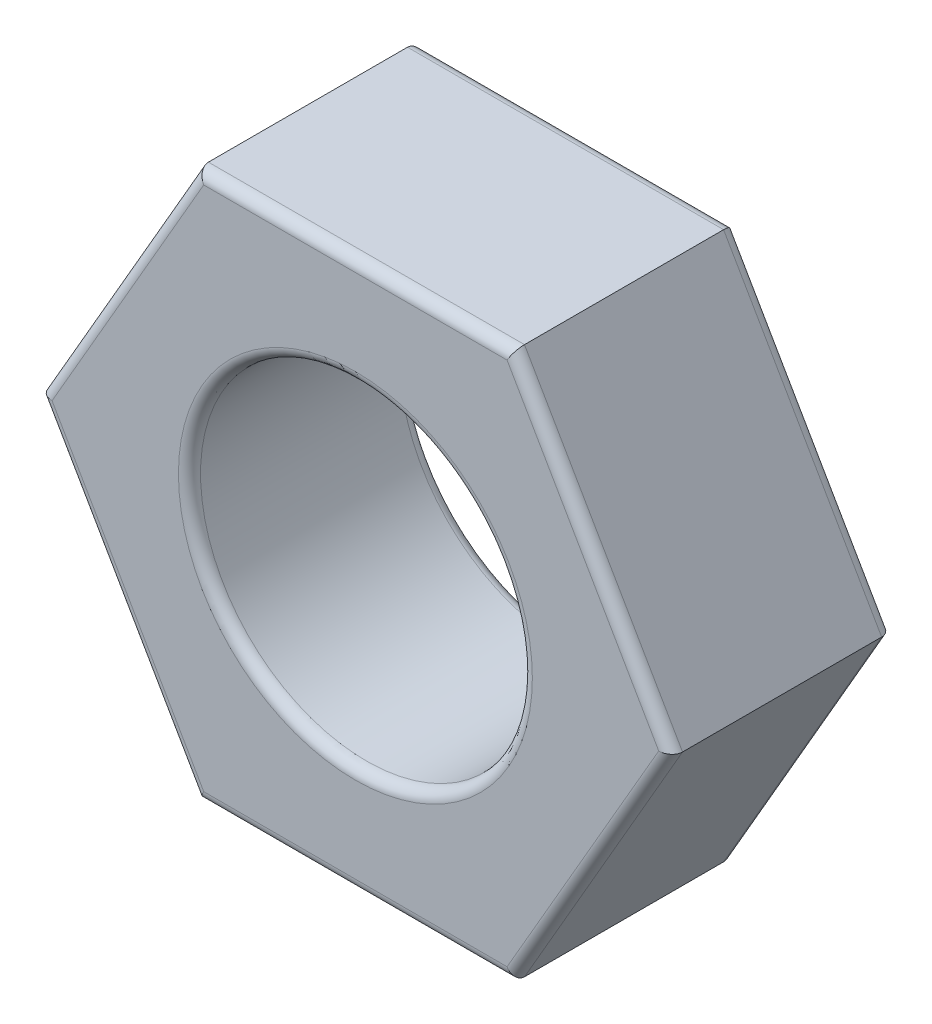
ISO-10303-21;
HEADER;
FILE_DESCRIPTION(('STEP AP214'),'2;1');
FILE_NAME('part.step','',(''),(''),'','','');
FILE_SCHEMA(('AUTOMOTIVE_DESIGN { 1 0 10303 214 1 1 1 1 }'));
ENDSEC;
DATA;
#1=APPLICATION_CONTEXT('core data for automotive mechanical design processes');
#2=APPLICATION_PROTOCOL_DEFINITION('international standard','automotive_design',2000,#1);
#3=PRODUCT_CONTEXT('',#1,'mechanical');
#4=PRODUCT('Part','Part','',(#3));
#5=PRODUCT_RELATED_PRODUCT_CATEGORY('part','',(#4));
#6=PRODUCT_DEFINITION_FORMATION('','',#4);
#7=PRODUCT_DEFINITION_CONTEXT('part definition',#1,'design');
#8=PRODUCT_DEFINITION('design','',#6,#7);
#9=PRODUCT_DEFINITION_SHAPE('','',#8);
#10=(LENGTH_UNIT() NAMED_UNIT(*) SI_UNIT(.MILLI.,.METRE.));
#11=(NAMED_UNIT(*) PLANE_ANGLE_UNIT() SI_UNIT($,.RADIAN.));
#12=(NAMED_UNIT(*) SI_UNIT($,.STERADIAN.) SOLID_ANGLE_UNIT());
#13=UNCERTAINTY_MEASURE_WITH_UNIT(LENGTH_MEASURE(1.E-05),#10,'distance_accuracy_value','');
#14=(GEOMETRIC_REPRESENTATION_CONTEXT(3) GLOBAL_UNCERTAINTY_ASSIGNED_CONTEXT((#13)) GLOBAL_UNIT_ASSIGNED_CONTEXT((#10,
#11,#12)) REPRESENTATION_CONTEXT('',''));
#15=CARTESIAN_POINT('',(0.,0.,0.));
#16=DIRECTION('',(0.,0.,1.));
#17=DIRECTION('',(1.,0.,0.));
#18=AXIS2_PLACEMENT_3D('',#15,#16,#17);
#19=CARTESIAN_POINT('',(0.,9.90000000000001,4.));
#20=DIRECTION('',(0.,0.,1.));
#21=DIRECTION('',(1.,0.,0.));
#22=AXIS2_PLACEMENT_3D('',#19,#20,#21);
#23=PLANE('',#22);
#24=CARTESIAN_POINT('',(0.,0.,4.));
#25=DIRECTION('',(0.,0.,1.));
#26=DIRECTION('',(1.,0.,0.));
#27=AXIS2_PLACEMENT_3D('',#24,#25,#26);
#28=CIRCLE('',#27,3.2);
#29=CARTESIAN_POINT('',(3.2,0.,4.));
#30=VERTEX_POINT('',#29);
#31=EDGE_CURVE('E11',#30,#30,#28,.F.);
#32=ORIENTED_EDGE('',*,*,#31,.T.);
#33=EDGE_LOOP('',(#32));
#34=FACE_BOUND('',#33,.T.);
#35=DIRECTION('',(1.,0.,0.));
#36=VECTOR('',#35,1.);
#37=CARTESIAN_POINT('',(2.85788383248865,-4.75,4.));
#38=LINE('',#37,#36);
#39=CARTESIAN_POINT('',(-2.74241377865073,-4.75,4.));
#40=VERTEX_POINT('',#39);
#41=CARTESIAN_POINT('',(2.74241377865073,-4.75,4.));
#42=VERTEX_POINT('',#41);
#43=EDGE_CURVE('E42',#40,#42,#38,.T.);
#44=ORIENTED_EDGE('',*,*,#43,.T.);
#45=DIRECTION('',(0.5,0.866025403784439,0.));
#46=VECTOR('',#45,1.);
#47=CARTESIAN_POINT('',(5.54256258422041,0.0999999999999977,4.));
#48=LINE('',#47,#46);
#49=CARTESIAN_POINT('',(5.48482755730145,0.,4.));
#50=VERTEX_POINT('',#49);
#51=EDGE_CURVE('E35',#42,#50,#48,.T.);
#52=ORIENTED_EDGE('',*,*,#51,.T.);
#53=DIRECTION('',(-0.5,0.866025403784439,0.));
#54=VECTOR('',#53,1.);
#55=CARTESIAN_POINT('',(2.68467875173176,4.85,4.));
#56=LINE('',#55,#54);
#57=CARTESIAN_POINT('',(2.74241377865072,4.75000000000001,4.));
#58=VERTEX_POINT('',#57);
#59=EDGE_CURVE('E181',#50,#58,#56,.T.);
#60=ORIENTED_EDGE('',*,*,#59,.T.);
#61=DIRECTION('',(-1.,0.,0.));
#62=VECTOR('',#61,1.);
#63=CARTESIAN_POINT('',(-2.85788383248865,4.75000000000001,4.));
#64=LINE('',#63,#62);
#65=CARTESIAN_POINT('',(-2.74241377865072,4.75000000000001,4.));
#66=VERTEX_POINT('',#65);
#67=EDGE_CURVE('E183',#58,#66,#64,.T.);
#68=ORIENTED_EDGE('',*,*,#67,.T.);
#69=DIRECTION('',(-0.5,-0.866025403784439,0.));
#70=VECTOR('',#69,1.);
#71=CARTESIAN_POINT('',(-5.54256258422041,-0.100000000000003,4.));
#72=LINE('',#71,#70);
#73=CARTESIAN_POINT('',(-5.48482755730145,0.,4.));
#74=VERTEX_POINT('',#73);
#75=EDGE_CURVE('E185',#66,#74,#72,.T.);
#76=ORIENTED_EDGE('',*,*,#75,.T.);
#77=DIRECTION('',(0.5,-0.866025403784439,0.));
#78=VECTOR('',#77,1.);
#79=CARTESIAN_POINT('',(-2.68467875173176,-4.85,4.));
#80=LINE('',#79,#78);
#81=EDGE_CURVE('E47',#74,#40,#80,.T.);
#82=ORIENTED_EDGE('',*,*,#81,.T.);
#83=EDGE_LOOP('',(#44,#52,#60,#68,#76,#82));
#84=FACE_BOUND('',#83,.T.);
#85=ADVANCED_FACE('F27',(#34,#84),#23,.T.);
#86=CARTESIAN_POINT('',(0.,9.90000000000001,0.));
#87=DIRECTION('',(0.,0.,1.));
#88=DIRECTION('',(1.,0.,0.));
#89=AXIS2_PLACEMENT_3D('',#86,#87,#88);
#90=PLANE('',#89);
#91=CARTESIAN_POINT('',(0.,0.,0.));
#92=DIRECTION('',(0.,0.,1.));
#93=DIRECTION('',(1.,0.,0.));
#94=AXIS2_PLACEMENT_3D('',#91,#92,#93);
#95=CIRCLE('',#94,3.2);
#96=CARTESIAN_POINT('',(3.2,0.,0.));
#97=VERTEX_POINT('',#96);
#98=EDGE_CURVE('E143',#97,#97,#95,.T.);
#99=ORIENTED_EDGE('',*,*,#98,.T.);
#100=EDGE_LOOP('',(#99));
#101=FACE_BOUND('',#100,.T.);
#102=DIRECTION('',(-0.5,-0.866025403784439,0.));
#103=VECTOR('',#102,1.);
#104=CARTESIAN_POINT('',(0.173205080756888,9.8,0.));
#105=LINE('',#104,#103);
#106=CARTESIAN_POINT('',(-5.48482755730145,0.,0.));
#107=VERTEX_POINT('',#106);
#108=CARTESIAN_POINT('',(-2.74241377865072,4.75000000000001,0.));
#109=VERTEX_POINT('',#108);
#110=EDGE_CURVE('E142',#107,#109,#105,.F.);
#111=ORIENTED_EDGE('',*,*,#110,.T.);
#112=DIRECTION('',(-1.,0.,0.));
#113=VECTOR('',#112,1.);
#114=CARTESIAN_POINT('',(0.,4.75000000000001,0.));
#115=LINE('',#114,#113);
#116=CARTESIAN_POINT('',(2.74241377865072,4.75000000000001,0.));
#117=VERTEX_POINT('',#116);
#118=EDGE_CURVE('E121',#109,#117,#115,.F.);
#119=ORIENTED_EDGE('',*,*,#118,.T.);
#120=DIRECTION('',(-0.5,0.866025403784439,0.));
#121=VECTOR('',#120,1.);
#122=CARTESIAN_POINT('',(-0.173205080756887,9.80000000000001,0.));
#123=LINE('',#122,#121);
#124=CARTESIAN_POINT('',(5.48482755730145,0.,0.));
#125=VERTEX_POINT('',#124);
#126=EDGE_CURVE('E131',#117,#125,#123,.F.);
#127=ORIENTED_EDGE('',*,*,#126,.T.);
#128=DIRECTION('',(0.5,0.866025403784439,0.));
#129=VECTOR('',#128,1.);
#130=CARTESIAN_POINT('',(8.40044641670906,5.05,0.));
#131=LINE('',#130,#129);
#132=CARTESIAN_POINT('',(2.74241377865073,-4.75,0.));
#133=VERTEX_POINT('',#132);
#134=EDGE_CURVE('E137',#125,#133,#131,.F.);
#135=ORIENTED_EDGE('',*,*,#134,.T.);
#136=DIRECTION('',(1.,0.,0.));
#137=VECTOR('',#136,1.);
#138=CARTESIAN_POINT('',(0.,-4.75,0.));
#139=LINE('',#138,#137);
#140=CARTESIAN_POINT('',(-2.74241377865073,-4.75,0.));
#141=VERTEX_POINT('',#140);
#142=EDGE_CURVE('E247',#133,#141,#139,.F.);
#143=ORIENTED_EDGE('',*,*,#142,.T.);
#144=DIRECTION('',(0.5,-0.866025403784439,0.));
#145=VECTOR('',#144,1.);
#146=CARTESIAN_POINT('',(-8.40044641670906,5.05,0.));
#147=LINE('',#146,#145);
#148=EDGE_CURVE('E148',#141,#107,#147,.F.);
#149=ORIENTED_EDGE('',*,*,#148,.T.);
#150=EDGE_LOOP('',(#111,#119,#127,#135,#143,#149));
#151=FACE_BOUND('',#150,.T.);
#152=ADVANCED_FACE('F140',(#101,#151),#90,.F.);
#153=CARTESIAN_POINT('',(5.7157676649773,0.,4.));
#154=DIRECTION('',(-0.866025403784439,-0.5,0.));
#155=DIRECTION('',(0.5,-0.866025403784439,0.));
#156=AXIS2_PLACEMENT_3D('',#153,#154,#155);
#157=PLANE('',#156);
#158=DIRECTION('',(0.,0.,-1.));
#159=VECTOR('',#158,1.);
#160=CARTESIAN_POINT('',(5.7157676649773,0.,4.));
#161=LINE('',#160,#159);
#162=CARTESIAN_POINT('',(5.7157676649773,0.,3.8));
#163=VERTEX_POINT('',#162);
#164=CARTESIAN_POINT('',(5.7157676649773,0.,0.2));
#165=VERTEX_POINT('',#164);
#166=EDGE_CURVE('E229',#163,#165,#161,.T.);
#167=ORIENTED_EDGE('',*,*,#166,.T.);
#168=DIRECTION('',(-0.5,0.866025403784439,0.));
#169=VECTOR('',#168,1.);
#170=CARTESIAN_POINT('',(5.7157676649773,0.,0.2));
#171=LINE('',#170,#169);
#172=CARTESIAN_POINT('',(2.85788383248865,4.95000000000001,0.2));
#173=VERTEX_POINT('',#172);
#174=EDGE_CURVE('E179',#165,#173,#171,.T.);
#175=ORIENTED_EDGE('',*,*,#174,.T.);
#176=DIRECTION('',(0.,0.,-1.));
#177=VECTOR('',#176,1.);
#178=CARTESIAN_POINT('',(2.85788383248865,4.95000000000001,4.));
#179=LINE('',#178,#177);
#180=CARTESIAN_POINT('',(2.85788383248865,4.95000000000001,3.8));
#181=VERTEX_POINT('',#180);
#182=EDGE_CURVE('E138',#181,#173,#179,.T.);
#183=ORIENTED_EDGE('',*,*,#182,.F.);
#184=DIRECTION('',(-0.5,0.866025403784439,0.));
#185=VECTOR('',#184,1.);
#186=CARTESIAN_POINT('',(5.7157676649773,0.,3.8));
#187=LINE('',#186,#185);
#188=EDGE_CURVE('E177',#181,#163,#187,.F.);
#189=ORIENTED_EDGE('',*,*,#188,.T.);
#190=EDGE_LOOP('',(#167,#175,#183,#189));
#191=FACE_BOUND('',#190,.T.);
#192=ADVANCED_FACE('F29',(#191),#157,.F.);
#193=CARTESIAN_POINT('',(2.85788383248865,4.95000000000001,4.));
#194=DIRECTION('',(0.,-1.,0.));
#195=DIRECTION('',(0.,0.,-1.));
#196=AXIS2_PLACEMENT_3D('',#193,#194,#195);
#197=PLANE('',#196);
#198=ORIENTED_EDGE('',*,*,#182,.T.);
#199=DIRECTION('',(-1.,0.,0.));
#200=VECTOR('',#199,1.);
#201=CARTESIAN_POINT('',(2.85788383248865,4.95000000000001,0.2));
#202=LINE('',#201,#200);
#203=CARTESIAN_POINT('',(-2.85788383248865,4.95000000000001,0.2));
#204=VERTEX_POINT('',#203);
#205=EDGE_CURVE('E124',#173,#204,#202,.T.);
#206=ORIENTED_EDGE('',*,*,#205,.T.);
#207=DIRECTION('',(0.,0.,-1.));
#208=VECTOR('',#207,1.);
#209=CARTESIAN_POINT('',(-2.85788383248865,4.95000000000001,4.));
#210=LINE('',#209,#208);
#211=CARTESIAN_POINT('',(-2.85788383248865,4.95000000000001,3.8));
#212=VERTEX_POINT('',#211);
#213=EDGE_CURVE('E241',#212,#204,#210,.T.);
#214=ORIENTED_EDGE('',*,*,#213,.F.);
#215=DIRECTION('',(-1.,0.,0.));
#216=VECTOR('',#215,1.);
#217=CARTESIAN_POINT('',(2.85788383248865,4.95000000000001,3.8));
#218=LINE('',#217,#216);
#219=EDGE_CURVE('E157',#212,#181,#218,.F.);
#220=ORIENTED_EDGE('',*,*,#219,.T.);
#221=EDGE_LOOP('',(#198,#206,#214,#220));
#222=FACE_BOUND('',#221,.T.);
#223=ADVANCED_FACE('F262',(#222),#197,.F.);
#224=CARTESIAN_POINT('',(-2.85788383248865,4.95000000000001,4.));
#225=DIRECTION('',(0.866025403784438,-0.5,0.));
#226=DIRECTION('',(0.5,0.866025403784439,0.));
#227=AXIS2_PLACEMENT_3D('',#224,#225,#226);
#228=PLANE('',#227);
#229=ORIENTED_EDGE('',*,*,#213,.T.);
#230=DIRECTION('',(-0.5,-0.866025403784439,0.));
#231=VECTOR('',#230,1.);
#232=CARTESIAN_POINT('',(-2.85788383248865,4.95000000000001,0.2));
#233=LINE('',#232,#231);
#234=CARTESIAN_POINT('',(-5.7157676649773,0.,0.2));
#235=VERTEX_POINT('',#234);
#236=EDGE_CURVE('E162',#204,#235,#233,.T.);
#237=ORIENTED_EDGE('',*,*,#236,.T.);
#238=DIRECTION('',(0.,0.,-1.));
#239=VECTOR('',#238,1.);
#240=CARTESIAN_POINT('',(-5.7157676649773,0.,4.));
#241=LINE('',#240,#239);
#242=CARTESIAN_POINT('',(-5.7157676649773,0.,3.8));
#243=VERTEX_POINT('',#242);
#244=EDGE_CURVE('E238',#243,#235,#241,.T.);
#245=ORIENTED_EDGE('',*,*,#244,.F.);
#246=DIRECTION('',(-0.5,-0.866025403784439,0.));
#247=VECTOR('',#246,1.);
#248=CARTESIAN_POINT('',(-2.85788383248865,4.95,3.8));
#249=LINE('',#248,#247);
#250=EDGE_CURVE('E160',#243,#212,#249,.F.);
#251=ORIENTED_EDGE('',*,*,#250,.T.);
#252=EDGE_LOOP('',(#229,#237,#245,#251));
#253=FACE_BOUND('',#252,.T.);
#254=ADVANCED_FACE('F265',(#253),#228,.F.);
#255=CARTESIAN_POINT('',(-5.7157676649773,0.,4.));
#256=DIRECTION('',(0.866025403784439,0.5,0.));
#257=DIRECTION('',(-0.5,0.866025403784439,0.));
#258=AXIS2_PLACEMENT_3D('',#255,#256,#257);
#259=PLANE('',#258);
#260=ORIENTED_EDGE('',*,*,#244,.T.);
#261=DIRECTION('',(0.5,-0.866025403784439,0.));
#262=VECTOR('',#261,1.);
#263=CARTESIAN_POINT('',(-5.7157676649773,0.,0.2));
#264=LINE('',#263,#262);
#265=CARTESIAN_POINT('',(-2.85788383248865,-4.95,0.2));
#266=VERTEX_POINT('',#265);
#267=EDGE_CURVE('E166',#235,#266,#264,.T.);
#268=ORIENTED_EDGE('',*,*,#267,.T.);
#269=DIRECTION('',(0.,0.,-1.));
#270=VECTOR('',#269,1.);
#271=CARTESIAN_POINT('',(-2.85788383248865,-4.95,4.));
#272=LINE('',#271,#270);
#273=CARTESIAN_POINT('',(-2.85788383248865,-4.95,3.8));
#274=VERTEX_POINT('',#273);
#275=EDGE_CURVE('E235',#274,#266,#272,.T.);
#276=ORIENTED_EDGE('',*,*,#275,.F.);
#277=DIRECTION('',(0.5,-0.866025403784439,0.));
#278=VECTOR('',#277,1.);
#279=CARTESIAN_POINT('',(-5.7157676649773,0.,3.8));
#280=LINE('',#279,#278);
#281=EDGE_CURVE('E164',#274,#243,#280,.F.);
#282=ORIENTED_EDGE('',*,*,#281,.T.);
#283=EDGE_LOOP('',(#260,#268,#276,#282));
#284=FACE_BOUND('',#283,.T.);
#285=ADVANCED_FACE('F310',(#284),#259,.F.);
#286=CARTESIAN_POINT('',(-2.85788383248865,-4.95,4.));
#287=DIRECTION('',(0.,1.,0.));
#288=DIRECTION('',(0.,0.,1.));
#289=AXIS2_PLACEMENT_3D('',#286,#287,#288);
#290=PLANE('',#289);
#291=ORIENTED_EDGE('',*,*,#275,.T.);
#292=DIRECTION('',(1.,0.,0.));
#293=VECTOR('',#292,1.);
#294=CARTESIAN_POINT('',(-2.85788383248865,-4.95,0.2));
#295=LINE('',#294,#293);
#296=CARTESIAN_POINT('',(2.85788383248865,-4.95,0.2));
#297=VERTEX_POINT('',#296);
#298=EDGE_CURVE('E170',#266,#297,#295,.T.);
#299=ORIENTED_EDGE('',*,*,#298,.T.);
#300=DIRECTION('',(0.,0.,-1.));
#301=VECTOR('',#300,1.);
#302=CARTESIAN_POINT('',(2.85788383248865,-4.95,4.));
#303=LINE('',#302,#301);
#304=CARTESIAN_POINT('',(2.85788383248865,-4.95,3.8));
#305=VERTEX_POINT('',#304);
#306=EDGE_CURVE('E232',#305,#297,#303,.T.);
#307=ORIENTED_EDGE('',*,*,#306,.F.);
#308=DIRECTION('',(1.,0.,0.));
#309=VECTOR('',#308,1.);
#310=CARTESIAN_POINT('',(-2.85788383248865,-4.95,3.8));
#311=LINE('',#310,#309);
#312=EDGE_CURVE('E168',#305,#274,#311,.F.);
#313=ORIENTED_EDGE('',*,*,#312,.T.);
#314=EDGE_LOOP('',(#291,#299,#307,#313));
#315=FACE_BOUND('',#314,.T.);
#316=ADVANCED_FACE('F283',(#315),#290,.F.);
#317=CARTESIAN_POINT('',(2.85788383248865,-4.95,4.));
#318=DIRECTION('',(-0.866025403784439,0.5,0.));
#319=DIRECTION('',(-0.5,-0.866025403784439,0.));
#320=AXIS2_PLACEMENT_3D('',#317,#318,#319);
#321=PLANE('',#320);
#322=ORIENTED_EDGE('',*,*,#306,.T.);
#323=DIRECTION('',(0.5,0.866025403784439,0.));
#324=VECTOR('',#323,1.);
#325=CARTESIAN_POINT('',(2.85788383248865,-4.95,0.2));
#326=LINE('',#325,#324);
#327=EDGE_CURVE('E175',#297,#165,#326,.T.);
#328=ORIENTED_EDGE('',*,*,#327,.T.);
#329=ORIENTED_EDGE('',*,*,#166,.F.);
#330=DIRECTION('',(0.5,0.866025403784439,0.));
#331=VECTOR('',#330,1.);
#332=CARTESIAN_POINT('',(2.85788383248865,-4.95000000000001,3.8));
#333=LINE('',#332,#331);
#334=EDGE_CURVE('E172',#163,#305,#333,.F.);
#335=ORIENTED_EDGE('',*,*,#334,.T.);
#336=EDGE_LOOP('',(#322,#328,#329,#335));
#337=FACE_BOUND('',#336,.T.);
#338=ADVANCED_FACE('F281',(#337),#321,.F.);
#339=CARTESIAN_POINT('',(0.,0.,4.));
#340=DIRECTION('',(0.,0.,-1.));
#341=DIRECTION('',(-1.,0.,0.));
#342=AXIS2_PLACEMENT_3D('',#339,#340,#341);
#343=CYLINDRICAL_SURFACE('',#342,3.);
#344=CARTESIAN_POINT('',(0.,0.,0.2));
#345=DIRECTION('',(0.,0.,1.));
#346=DIRECTION('',(1.,0.,0.));
#347=AXIS2_PLACEMENT_3D('',#344,#345,#346);
#348=CIRCLE('',#347,3.);
#349=CARTESIAN_POINT('',(3.,0.,0.2));
#350=VERTEX_POINT('',#349);
#351=EDGE_CURVE('E154',#350,#350,#348,.F.);
#352=ORIENTED_EDGE('',*,*,#351,.T.);
#353=EDGE_LOOP('',(#352));
#354=FACE_BOUND('',#353,.T.);
#355=CARTESIAN_POINT('',(0.,0.,3.8));
#356=DIRECTION('',(0.,0.,1.));
#357=DIRECTION('',(1.,0.,0.));
#358=AXIS2_PLACEMENT_3D('',#355,#356,#357);
#359=CIRCLE('',#358,3.);
#360=CARTESIAN_POINT('',(3.,0.,3.8));
#361=VERTEX_POINT('',#360);
#362=EDGE_CURVE('E146',#361,#361,#359,.T.);
#363=ORIENTED_EDGE('',*,*,#362,.T.);
#364=EDGE_LOOP('',(#363));
#365=FACE_BOUND('',#364,.T.);
#366=ADVANCED_FACE('F307',(#354,#365),#343,.F.);
#367=CARTESIAN_POINT('',(0.,0.,0.2));
#368=DIRECTION('',(0.,0.,1.));
#369=DIRECTION('',(1.,0.,0.));
#370=AXIS2_PLACEMENT_3D('',#367,#368,#369);
#371=TOROIDAL_SURFACE('',#370,3.2,0.2);
#372=ORIENTED_EDGE('',*,*,#351,.F.);
#373=EDGE_LOOP('',(#372));
#374=FACE_BOUND('',#373,.T.);
#375=ORIENTED_EDGE('',*,*,#98,.F.);
#376=EDGE_LOOP('',(#375));
#377=FACE_BOUND('',#376,.T.);
#378=ADVANCED_FACE('F337',(#374,#377),#371,.T.);
#379=CARTESIAN_POINT('',(-2.85788383248865,-4.75,0.2));
#380=DIRECTION('',(1.,0.,0.));
#381=DIRECTION('',(0.,0.,-1.));
#382=AXIS2_PLACEMENT_3D('',#379,#380,#381);
#383=CYLINDRICAL_SURFACE('',#382,0.2);
#384=CARTESIAN_POINT('',(-2.74241377865073,-4.75,0.2));
#385=DIRECTION('',(0.866025403784439,-0.5,0.));
#386=DIRECTION('',(0.5,0.866025403784439,0.));
#387=AXIS2_PLACEMENT_3D('',#384,#385,#386);
#388=ELLIPSE('',#387,0.23094010767585,0.2);
#389=EDGE_CURVE('E223',#141,#266,#388,.F.);
#390=ORIENTED_EDGE('',*,*,#389,.F.);
#391=ORIENTED_EDGE('',*,*,#142,.F.);
#392=CARTESIAN_POINT('',(2.74241377865073,-4.75,0.2));
#393=DIRECTION('',(0.866025403784439,0.5,0.));
#394=DIRECTION('',(-0.5,0.866025403784439,0.));
#395=AXIS2_PLACEMENT_3D('',#392,#393,#394);
#396=ELLIPSE('',#395,0.23094010767585,0.2);
#397=EDGE_CURVE('E226',#297,#133,#396,.T.);
#398=ORIENTED_EDGE('',*,*,#397,.F.);
#399=ORIENTED_EDGE('',*,*,#298,.F.);
#400=EDGE_LOOP('',(#390,#391,#398,#399));
#401=FACE_BOUND('',#400,.T.);
#402=ADVANCED_FACE('F286',(#401),#383,.T.);
#403=CARTESIAN_POINT('',(2.68467875173176,-4.85,0.2));
#404=DIRECTION('',(0.5,0.866025403784439,0.));
#405=DIRECTION('',(-0.866025403784439,0.5,0.));
#406=AXIS2_PLACEMENT_3D('',#403,#404,#405);
#407=CYLINDRICAL_SURFACE('',#406,0.2);
#408=ORIENTED_EDGE('',*,*,#397,.T.);
#409=ORIENTED_EDGE('',*,*,#134,.F.);
#410=CARTESIAN_POINT('',(5.48482755730145,0.,0.2));
#411=DIRECTION('',(0.,1.,0.));
#412=DIRECTION('',(-1.,0.,0.));
#413=AXIS2_PLACEMENT_3D('',#410,#411,#412);
#414=ELLIPSE('',#413,0.23094010767585,0.2);
#415=EDGE_CURVE('E134',#165,#125,#414,.T.);
#416=ORIENTED_EDGE('',*,*,#415,.F.);
#417=ORIENTED_EDGE('',*,*,#327,.F.);
#418=EDGE_LOOP('',(#408,#409,#416,#417));
#419=FACE_BOUND('',#418,.T.);
#420=ADVANCED_FACE('F289',(#419),#407,.T.);
#421=CARTESIAN_POINT('',(-5.54256258422041,0.100000000000001,0.2));
#422=DIRECTION('',(0.5,-0.866025403784439,0.));
#423=DIRECTION('',(0.866025403784439,0.5,0.));
#424=AXIS2_PLACEMENT_3D('',#421,#422,#423);
#425=CYLINDRICAL_SURFACE('',#424,0.2);
#426=ORIENTED_EDGE('',*,*,#389,.T.);
#427=ORIENTED_EDGE('',*,*,#267,.F.);
#428=CARTESIAN_POINT('',(-5.48482755730145,0.,0.2));
#429=DIRECTION('',(0.,-1.,0.));
#430=DIRECTION('',(1.,0.,0.));
#431=AXIS2_PLACEMENT_3D('',#428,#429,#430);
#432=ELLIPSE('',#431,0.23094010767585,0.2);
#433=EDGE_CURVE('E127',#107,#235,#432,.F.);
#434=ORIENTED_EDGE('',*,*,#433,.F.);
#435=ORIENTED_EDGE('',*,*,#148,.F.);
#436=EDGE_LOOP('',(#426,#427,#434,#435));
#437=FACE_BOUND('',#436,.T.);
#438=ADVANCED_FACE('F254',(#437),#425,.T.);
#439=CARTESIAN_POINT('',(5.54256258422041,-0.100000000000002,0.2));
#440=DIRECTION('',(-0.5,0.866025403784439,0.));
#441=DIRECTION('',(-0.866025403784439,-0.5,0.));
#442=AXIS2_PLACEMENT_3D('',#439,#440,#441);
#443=CYLINDRICAL_SURFACE('',#442,0.2);
#444=ORIENTED_EDGE('',*,*,#415,.T.);
#445=ORIENTED_EDGE('',*,*,#126,.F.);
#446=CARTESIAN_POINT('',(2.74241377865072,4.75000000000001,0.2));
#447=DIRECTION('',(-0.866025403784439,0.5,0.));
#448=DIRECTION('',(0.5,0.866025403784439,0.));
#449=AXIS2_PLACEMENT_3D('',#446,#447,#448);
#450=ELLIPSE('',#449,0.23094010767585,0.2);
#451=EDGE_CURVE('E117',#173,#117,#450,.T.);
#452=ORIENTED_EDGE('',*,*,#451,.F.);
#453=ORIENTED_EDGE('',*,*,#174,.F.);
#454=EDGE_LOOP('',(#444,#445,#452,#453));
#455=FACE_BOUND('',#454,.T.);
#456=ADVANCED_FACE('F132',(#455),#443,.T.);
#457=CARTESIAN_POINT('',(-2.68467875173176,4.85,0.2));
#458=DIRECTION('',(-0.5,-0.866025403784439,0.));
#459=DIRECTION('',(0.866025403784438,-0.5,0.));
#460=AXIS2_PLACEMENT_3D('',#457,#458,#459);
#461=CYLINDRICAL_SURFACE('',#460,0.2);
#462=ORIENTED_EDGE('',*,*,#433,.T.);
#463=ORIENTED_EDGE('',*,*,#236,.F.);
#464=CARTESIAN_POINT('',(-2.74241377865072,4.75000000000001,0.2));
#465=DIRECTION('',(-0.866025403784439,-0.5,0.));
#466=DIRECTION('',(0.5,-0.866025403784439,0.));
#467=AXIS2_PLACEMENT_3D('',#464,#465,#466);
#468=ELLIPSE('',#467,0.23094010767585,0.2);
#469=EDGE_CURVE('E128',#109,#204,#468,.F.);
#470=ORIENTED_EDGE('',*,*,#469,.F.);
#471=ORIENTED_EDGE('',*,*,#110,.F.);
#472=EDGE_LOOP('',(#462,#463,#470,#471));
#473=FACE_BOUND('',#472,.T.);
#474=ADVANCED_FACE('F257',(#473),#461,.T.);
#475=CARTESIAN_POINT('',(2.85788383248865,4.75000000000001,0.2));
#476=DIRECTION('',(-1.,0.,0.));
#477=DIRECTION('',(0.,0.,1.));
#478=AXIS2_PLACEMENT_3D('',#475,#476,#477);
#479=CYLINDRICAL_SURFACE('',#478,0.2);
#480=ORIENTED_EDGE('',*,*,#451,.T.);
#481=ORIENTED_EDGE('',*,*,#118,.F.);
#482=ORIENTED_EDGE('',*,*,#469,.T.);
#483=ORIENTED_EDGE('',*,*,#205,.F.);
#484=EDGE_LOOP('',(#480,#481,#482,#483));
#485=FACE_BOUND('',#484,.T.);
#486=ADVANCED_FACE('F119',(#485),#479,.T.);
#487=CARTESIAN_POINT('',(0.,0.,3.8));
#488=DIRECTION('',(0.,0.,1.));
#489=DIRECTION('',(1.,0.,0.));
#490=AXIS2_PLACEMENT_3D('',#487,#488,#489);
#491=TOROIDAL_SURFACE('',#490,3.2,0.2);
#492=ORIENTED_EDGE('',*,*,#31,.F.);
#493=EDGE_LOOP('',(#492));
#494=FACE_BOUND('',#493,.T.);
#495=ORIENTED_EDGE('',*,*,#362,.F.);
#496=EDGE_LOOP('',(#495));
#497=FACE_BOUND('',#496,.T.);
#498=ADVANCED_FACE('F381',(#494,#497),#491,.T.);
#499=CARTESIAN_POINT('',(0.173205080756888,9.8,3.8));
#500=DIRECTION('',(0.5,0.866025403784439,0.));
#501=DIRECTION('',(-0.866025403784438,0.5,0.));
#502=AXIS2_PLACEMENT_3D('',#499,#500,#501);
#503=CYLINDRICAL_SURFACE('',#502,0.2);
#504=CARTESIAN_POINT('',(-2.74241377865072,4.75,3.8));
#505=DIRECTION('',(0.866025403784439,0.5,0.));
#506=DIRECTION('',(0.5,-0.866025403784439,0.));
#507=AXIS2_PLACEMENT_3D('',#504,#505,#506);
#508=ELLIPSE('',#507,0.23094010767585,0.2);
#509=EDGE_CURVE('E210',#212,#66,#508,.T.);
#510=ORIENTED_EDGE('',*,*,#509,.F.);
#511=ORIENTED_EDGE('',*,*,#250,.F.);
#512=CARTESIAN_POINT('',(-5.48482755730145,0.,3.8));
#513=DIRECTION('',(0.,1.,0.));
#514=DIRECTION('',(1.,0.,0.));
#515=AXIS2_PLACEMENT_3D('',#512,#513,#514);
#516=ELLIPSE('',#515,0.23094010767585,0.2);
#517=EDGE_CURVE('E216',#74,#243,#516,.F.);
#518=ORIENTED_EDGE('',*,*,#517,.F.);
#519=ORIENTED_EDGE('',*,*,#75,.F.);
#520=EDGE_LOOP('',(#510,#511,#518,#519));
#521=FACE_BOUND('',#520,.T.);
#522=ADVANCED_FACE('F269',(#521),#503,.T.);
#523=CARTESIAN_POINT('',(-8.40044641670906,5.05,3.8));
#524=DIRECTION('',(-0.5,0.866025403784439,0.));
#525=DIRECTION('',(-0.866025403784439,-0.5,0.));
#526=AXIS2_PLACEMENT_3D('',#523,#524,#525);
#527=CYLINDRICAL_SURFACE('',#526,0.2);
#528=ORIENTED_EDGE('',*,*,#517,.T.);
#529=ORIENTED_EDGE('',*,*,#281,.F.);
#530=CARTESIAN_POINT('',(-2.74241377865072,-4.75000000000001,3.8));
#531=DIRECTION('',(-0.866025403784439,0.5,0.));
#532=DIRECTION('',(0.5,0.866025403784439,0.));
#533=AXIS2_PLACEMENT_3D('',#530,#531,#532);
#534=ELLIPSE('',#533,0.23094010767585,0.2);
#535=EDGE_CURVE('E207',#40,#274,#534,.F.);
#536=ORIENTED_EDGE('',*,*,#535,.F.);
#537=ORIENTED_EDGE('',*,*,#81,.F.);
#538=EDGE_LOOP('',(#528,#529,#536,#537));
#539=FACE_BOUND('',#538,.T.);
#540=ADVANCED_FACE('F273',(#539),#527,.T.);
#541=CARTESIAN_POINT('',(0.,4.75000000000001,3.8));
#542=DIRECTION('',(1.,0.,0.));
#543=DIRECTION('',(0.,0.,-1.));
#544=AXIS2_PLACEMENT_3D('',#541,#542,#543);
#545=CYLINDRICAL_SURFACE('',#544,0.2);
#546=ORIENTED_EDGE('',*,*,#509,.T.);
#547=ORIENTED_EDGE('',*,*,#67,.F.);
#548=CARTESIAN_POINT('',(2.74241377865072,4.75000000000001,3.8));
#549=DIRECTION('',(0.866025403784439,-0.5,0.));
#550=DIRECTION('',(-0.5,-0.866025403784439,0.));
#551=AXIS2_PLACEMENT_3D('',#548,#549,#550);
#552=ELLIPSE('',#551,0.23094010767585,0.2);
#553=EDGE_CURVE('E204',#181,#58,#552,.T.);
#554=ORIENTED_EDGE('',*,*,#553,.F.);
#555=ORIENTED_EDGE('',*,*,#219,.F.);
#556=EDGE_LOOP('',(#546,#547,#554,#555));
#557=FACE_BOUND('',#556,.T.);
#558=ADVANCED_FACE('F401',(#557),#545,.T.);
#559=CARTESIAN_POINT('',(0.,-4.75,3.8));
#560=DIRECTION('',(-1.,0.,0.));
#561=DIRECTION('',(0.,0.,1.));
#562=AXIS2_PLACEMENT_3D('',#559,#560,#561);
#563=CYLINDRICAL_SURFACE('',#562,0.2);
#564=ORIENTED_EDGE('',*,*,#535,.T.);
#565=ORIENTED_EDGE('',*,*,#312,.F.);
#566=CARTESIAN_POINT('',(2.74241377865072,-4.75000000000001,3.8));
#567=DIRECTION('',(-0.866025403784439,-0.5,0.));
#568=DIRECTION('',(-0.5,0.866025403784439,0.));
#569=AXIS2_PLACEMENT_3D('',#566,#567,#568);
#570=ELLIPSE('',#569,0.23094010767585,0.2);
#571=EDGE_CURVE('E194',#42,#305,#570,.F.);
#572=ORIENTED_EDGE('',*,*,#571,.F.);
#573=ORIENTED_EDGE('',*,*,#43,.F.);
#574=EDGE_LOOP('',(#564,#565,#572,#573));
#575=FACE_BOUND('',#574,.T.);
#576=ADVANCED_FACE('F275',(#575),#563,.T.);
#577=CARTESIAN_POINT('',(-0.173205080756887,9.80000000000001,3.8));
#578=DIRECTION('',(0.5,-0.866025403784439,0.));
#579=DIRECTION('',(0.866025403784439,0.5,0.));
#580=AXIS2_PLACEMENT_3D('',#577,#578,#579);
#581=CYLINDRICAL_SURFACE('',#580,0.2);
#582=ORIENTED_EDGE('',*,*,#553,.T.);
#583=ORIENTED_EDGE('',*,*,#59,.F.);
#584=CARTESIAN_POINT('',(5.48482755730145,0.,3.8));
#585=DIRECTION('',(0.,-1.,0.));
#586=DIRECTION('',(1.,0.,0.));
#587=AXIS2_PLACEMENT_3D('',#584,#585,#586);
#588=ELLIPSE('',#587,0.23094010767585,0.2);
#589=EDGE_CURVE('E197',#163,#50,#588,.T.);
#590=ORIENTED_EDGE('',*,*,#589,.F.);
#591=ORIENTED_EDGE('',*,*,#188,.F.);
#592=EDGE_LOOP('',(#582,#583,#590,#591));
#593=FACE_BOUND('',#592,.T.);
#594=ADVANCED_FACE('F202',(#593),#581,.T.);
#595=CARTESIAN_POINT('',(8.40044641670906,5.05,3.8));
#596=DIRECTION('',(-0.5,-0.866025403784439,0.));
#597=DIRECTION('',(0.866025403784439,-0.5,0.));
#598=AXIS2_PLACEMENT_3D('',#595,#596,#597);
#599=CYLINDRICAL_SURFACE('',#598,0.2);
#600=ORIENTED_EDGE('',*,*,#571,.T.);
#601=ORIENTED_EDGE('',*,*,#334,.F.);
#602=ORIENTED_EDGE('',*,*,#589,.T.);
#603=ORIENTED_EDGE('',*,*,#51,.F.);
#604=EDGE_LOOP('',(#600,#601,#602,#603));
#605=FACE_BOUND('',#604,.T.);
#606=ADVANCED_FACE('F192',(#605),#599,.T.);
#607=CLOSED_SHELL('',(#85,#152,#192,#223,#254,#285,#316,#338,#366,#378,#402,#420,#438,#456,#474,
#486,#498,#522,#540,#558,#576,#594,#606));
#608=MANIFOLD_SOLID_BREP('B2',#607);
#609=ADVANCED_BREP_SHAPE_REPRESENTATION('',(#18,#608),#14);
#610=SHAPE_DEFINITION_REPRESENTATION(#9,#609);
ENDSEC;
END-ISO-10303-21;
